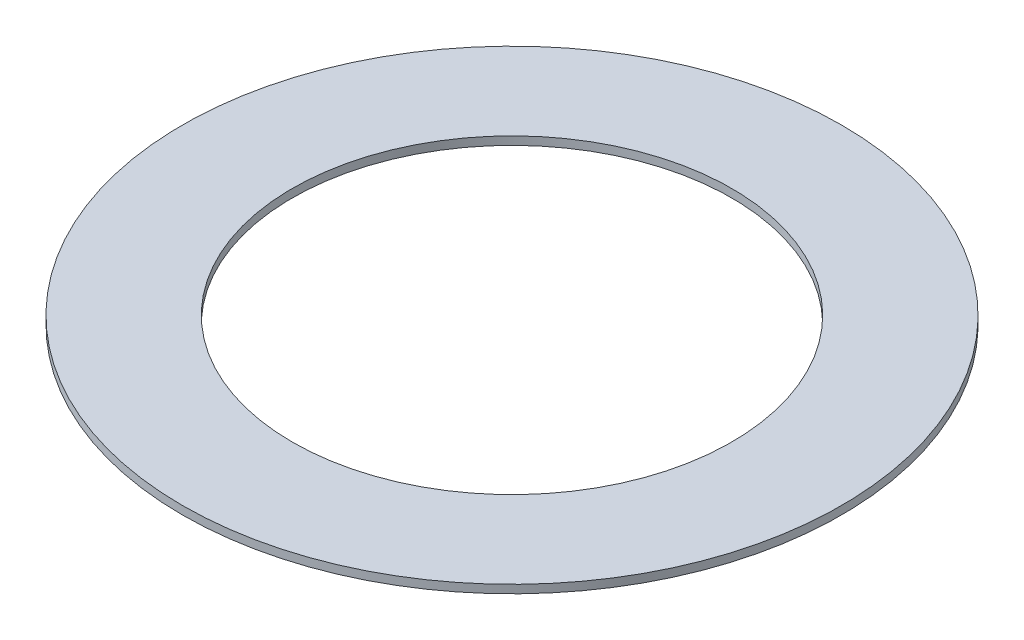
ISO-10303-21;
HEADER;
FILE_DESCRIPTION(('STEP AP214'),'2;1');
FILE_NAME('part.step','',(''),(''),'','','');
FILE_SCHEMA(('AUTOMOTIVE_DESIGN { 1 0 10303 214 1 1 1 1 }'));
ENDSEC;
DATA;
#1=APPLICATION_CONTEXT('core data for automotive mechanical design processes');
#2=APPLICATION_PROTOCOL_DEFINITION('international standard','automotive_design',2000,#1);
#3=PRODUCT_CONTEXT('',#1,'mechanical');
#4=PRODUCT('Part','Part','',(#3));
#5=PRODUCT_RELATED_PRODUCT_CATEGORY('part','',(#4));
#6=PRODUCT_DEFINITION_FORMATION('','',#4);
#7=PRODUCT_DEFINITION_CONTEXT('part definition',#1,'design');
#8=PRODUCT_DEFINITION('design','',#6,#7);
#9=PRODUCT_DEFINITION_SHAPE('','',#8);
#10=(LENGTH_UNIT() NAMED_UNIT(*) SI_UNIT(.MILLI.,.METRE.));
#11=(NAMED_UNIT(*) PLANE_ANGLE_UNIT() SI_UNIT($,.RADIAN.));
#12=(NAMED_UNIT(*) SI_UNIT($,.STERADIAN.) SOLID_ANGLE_UNIT());
#13=UNCERTAINTY_MEASURE_WITH_UNIT(LENGTH_MEASURE(1.E-05),#10,'distance_accuracy_value','');
#14=(GEOMETRIC_REPRESENTATION_CONTEXT(3) GLOBAL_UNCERTAINTY_ASSIGNED_CONTEXT((#13)) GLOBAL_UNIT_ASSIGNED_CONTEXT((#10,
#11,#12)) REPRESENTATION_CONTEXT('',''));
#15=CARTESIAN_POINT('',(0.,0.,0.));
#16=DIRECTION('',(0.,0.,1.));
#17=DIRECTION('',(1.,0.,0.));
#18=AXIS2_PLACEMENT_3D('',#15,#16,#17);
#19=CARTESIAN_POINT('',(0.,1.5,0.));
#20=DIRECTION('',(0.,1.,0.));
#21=DIRECTION('',(0.,0.,1.));
#22=AXIS2_PLACEMENT_3D('',#19,#20,#21);
#23=PLANE('',#22);
#24=CARTESIAN_POINT('',(0.,1.5,0.));
#25=DIRECTION('',(0.,1.,0.));
#26=DIRECTION('',(0.,0.,1.));
#27=AXIS2_PLACEMENT_3D('',#24,#25,#26);
#28=CIRCLE('',#27,120.);
#29=CARTESIAN_POINT('',(0.,1.5,120.));
#30=VERTEX_POINT('',#29);
#31=EDGE_CURVE('E10',#30,#30,#28,.T.);
#32=ORIENTED_EDGE('',*,*,#31,.T.);
#33=EDGE_LOOP('',(#32));
#34=FACE_BOUND('',#33,.T.);
#35=CARTESIAN_POINT('',(0.,1.5,0.));
#36=DIRECTION('',(0.,1.,0.));
#37=DIRECTION('',(0.,0.,1.));
#38=AXIS2_PLACEMENT_3D('',#35,#36,#37);
#39=CIRCLE('',#38,80.);
#40=CARTESIAN_POINT('',(0.,1.5,80.));
#41=VERTEX_POINT('',#40);
#42=EDGE_CURVE('E42',#41,#41,#39,.T.);
#43=ORIENTED_EDGE('',*,*,#42,.F.);
#44=EDGE_LOOP('',(#43));
#45=FACE_BOUND('',#44,.T.);
#46=ADVANCED_FACE('F31',(#34,#45),#23,.T.);
#47=CARTESIAN_POINT('',(0.,-1.5,0.));
#48=DIRECTION('',(0.,1.,0.));
#49=DIRECTION('',(0.,0.,1.));
#50=AXIS2_PLACEMENT_3D('',#47,#48,#49);
#51=PLANE('',#50);
#52=CARTESIAN_POINT('',(0.,-1.5,0.));
#53=DIRECTION('',(0.,1.,0.));
#54=DIRECTION('',(0.,0.,1.));
#55=AXIS2_PLACEMENT_3D('',#52,#53,#54);
#56=CIRCLE('',#55,120.);
#57=CARTESIAN_POINT('',(0.,-1.5,120.));
#58=VERTEX_POINT('',#57);
#59=EDGE_CURVE('E35',#58,#58,#56,.T.);
#60=ORIENTED_EDGE('',*,*,#59,.F.);
#61=EDGE_LOOP('',(#60));
#62=FACE_BOUND('',#61,.T.);
#63=CARTESIAN_POINT('',(0.,-1.5,0.));
#64=DIRECTION('',(0.,1.,0.));
#65=DIRECTION('',(0.,0.,1.));
#66=AXIS2_PLACEMENT_3D('',#63,#64,#65);
#67=CIRCLE('',#66,80.);
#68=CARTESIAN_POINT('',(0.,-1.5,80.));
#69=VERTEX_POINT('',#68);
#70=EDGE_CURVE('E44',#69,#69,#67,.T.);
#71=ORIENTED_EDGE('',*,*,#70,.T.);
#72=EDGE_LOOP('',(#71));
#73=FACE_BOUND('',#72,.T.);
#74=ADVANCED_FACE('F54',(#62,#73),#51,.F.);
#75=CARTESIAN_POINT('',(0.,1.5,0.));
#76=DIRECTION('',(0.,-1.,0.));
#77=DIRECTION('',(0.,0.,-1.));
#78=AXIS2_PLACEMENT_3D('',#75,#76,#77);
#79=CYLINDRICAL_SURFACE('',#78,120.);
#80=ORIENTED_EDGE('',*,*,#31,.F.);
#81=EDGE_LOOP('',(#80));
#82=FACE_BOUND('',#81,.T.);
#83=ORIENTED_EDGE('',*,*,#59,.T.);
#84=EDGE_LOOP('',(#83));
#85=FACE_BOUND('',#84,.T.);
#86=ADVANCED_FACE('F33',(#82,#85),#79,.T.);
#87=CARTESIAN_POINT('',(0.,1.5,0.));
#88=DIRECTION('',(0.,-1.,0.));
#89=DIRECTION('',(0.,0.,-1.));
#90=AXIS2_PLACEMENT_3D('',#87,#88,#89);
#91=CYLINDRICAL_SURFACE('',#90,80.);
#92=ORIENTED_EDGE('',*,*,#42,.T.);
#93=EDGE_LOOP('',(#92));
#94=FACE_BOUND('',#93,.T.);
#95=ORIENTED_EDGE('',*,*,#70,.F.);
#96=EDGE_LOOP('',(#95));
#97=FACE_BOUND('',#96,.T.);
#98=ADVANCED_FACE('F50',(#94,#97),#91,.F.);
#99=CLOSED_SHELL('',(#46,#74,#86,#98));
#100=MANIFOLD_SOLID_BREP('B2',#99);
#101=ADVANCED_BREP_SHAPE_REPRESENTATION('',(#18,#100),#14);
#102=SHAPE_DEFINITION_REPRESENTATION(#9,#101);
ENDSEC;
END-ISO-10303-21;
